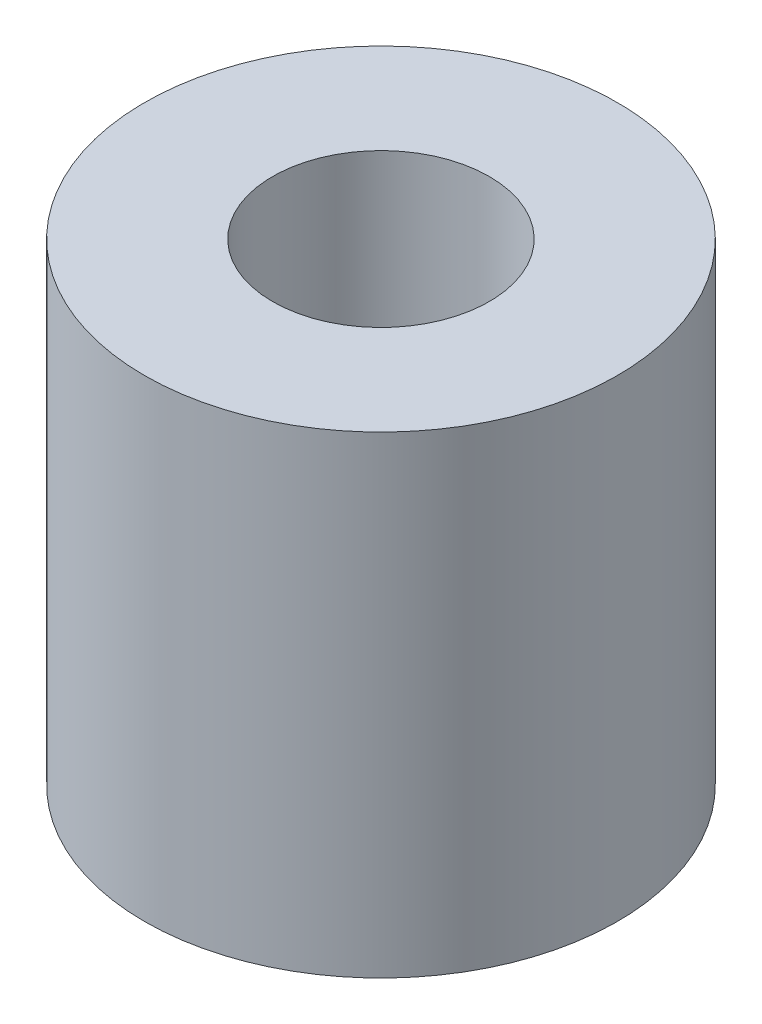
ISO-10303-21;
HEADER;
FILE_DESCRIPTION(('STEP AP214'),'2;1');
FILE_NAME('part.step','',(''),(''),'','','');
FILE_SCHEMA(('AUTOMOTIVE_DESIGN { 1 0 10303 214 1 1 1 1 }'));
ENDSEC;
DATA;
#1=APPLICATION_CONTEXT('core data for automotive mechanical design processes');
#2=APPLICATION_PROTOCOL_DEFINITION('international standard','automotive_design',2000,#1);
#3=PRODUCT_CONTEXT('',#1,'mechanical');
#4=PRODUCT('Part','Part','',(#3));
#5=PRODUCT_RELATED_PRODUCT_CATEGORY('part','',(#4));
#6=PRODUCT_DEFINITION_FORMATION('','',#4);
#7=PRODUCT_DEFINITION_CONTEXT('part definition',#1,'design');
#8=PRODUCT_DEFINITION('design','',#6,#7);
#9=PRODUCT_DEFINITION_SHAPE('','',#8);
#10=(LENGTH_UNIT() NAMED_UNIT(*) SI_UNIT(.MILLI.,.METRE.));
#11=(NAMED_UNIT(*) PLANE_ANGLE_UNIT() SI_UNIT($,.RADIAN.));
#12=(NAMED_UNIT(*) SI_UNIT($,.STERADIAN.) SOLID_ANGLE_UNIT());
#13=UNCERTAINTY_MEASURE_WITH_UNIT(LENGTH_MEASURE(1.E-05),#10,'distance_accuracy_value','');
#14=(GEOMETRIC_REPRESENTATION_CONTEXT(3) GLOBAL_UNCERTAINTY_ASSIGNED_CONTEXT((#13)) GLOBAL_UNIT_ASSIGNED_CONTEXT((#10,
#11,#12)) REPRESENTATION_CONTEXT('',''));
#15=CARTESIAN_POINT('',(0.,0.,0.));
#16=DIRECTION('',(0.,0.,1.));
#17=DIRECTION('',(1.,0.,0.));
#18=AXIS2_PLACEMENT_3D('',#15,#16,#17);
#19=CARTESIAN_POINT('',(0.,6.,0.));
#20=DIRECTION('',(0.,1.,0.));
#21=DIRECTION('',(0.,0.,1.));
#22=AXIS2_PLACEMENT_3D('',#19,#20,#21);
#23=PLANE('',#22);
#24=CARTESIAN_POINT('',(0.,6.,0.));
#25=DIRECTION('',(0.,1.,0.));
#26=DIRECTION('',(0.,0.,1.));
#27=AXIS2_PLACEMENT_3D('',#24,#25,#26);
#28=CIRCLE('',#27,3.);
#29=CARTESIAN_POINT('',(0.,6.,3.));
#30=VERTEX_POINT('',#29);
#31=EDGE_CURVE('E10',#30,#30,#28,.T.);
#32=ORIENTED_EDGE('',*,*,#31,.T.);
#33=EDGE_LOOP('',(#32));
#34=FACE_BOUND('',#33,.T.);
#35=CARTESIAN_POINT('',(0.,6.,0.));
#36=DIRECTION('',(0.,1.,0.));
#37=DIRECTION('',(0.,0.,1.));
#38=AXIS2_PLACEMENT_3D('',#35,#36,#37);
#39=CIRCLE('',#38,1.375);
#40=CARTESIAN_POINT('',(0.,6.,1.375));
#41=VERTEX_POINT('',#40);
#42=EDGE_CURVE('E41',#41,#41,#39,.T.);
#43=ORIENTED_EDGE('',*,*,#42,.F.);
#44=EDGE_LOOP('',(#43));
#45=FACE_BOUND('',#44,.T.);
#46=ADVANCED_FACE('F30',(#34,#45),#23,.T.);
#47=CARTESIAN_POINT('',(0.,0.,0.));
#48=DIRECTION('',(0.,1.,0.));
#49=DIRECTION('',(0.,0.,1.));
#50=AXIS2_PLACEMENT_3D('',#47,#48,#49);
#51=PLANE('',#50);
#52=CARTESIAN_POINT('',(0.,0.,0.));
#53=DIRECTION('',(0.,1.,0.));
#54=DIRECTION('',(0.,0.,1.));
#55=AXIS2_PLACEMENT_3D('',#52,#53,#54);
#56=CIRCLE('',#55,3.);
#57=CARTESIAN_POINT('',(0.,0.,3.));
#58=VERTEX_POINT('',#57);
#59=EDGE_CURVE('E34',#58,#58,#56,.T.);
#60=ORIENTED_EDGE('',*,*,#59,.F.);
#61=EDGE_LOOP('',(#60));
#62=FACE_BOUND('',#61,.T.);
#63=CARTESIAN_POINT('',(0.,0.,0.));
#64=DIRECTION('',(0.,1.,0.));
#65=DIRECTION('',(0.,0.,1.));
#66=AXIS2_PLACEMENT_3D('',#63,#64,#65);
#67=CIRCLE('',#66,1.375);
#68=CARTESIAN_POINT('',(0.,0.,1.375));
#69=VERTEX_POINT('',#68);
#70=EDGE_CURVE('E43',#69,#69,#67,.T.);
#71=ORIENTED_EDGE('',*,*,#70,.T.);
#72=EDGE_LOOP('',(#71));
#73=FACE_BOUND('',#72,.T.);
#74=ADVANCED_FACE('F53',(#62,#73),#51,.F.);
#75=CARTESIAN_POINT('',(0.,6.,0.));
#76=DIRECTION('',(0.,-1.,0.));
#77=DIRECTION('',(0.,0.,-1.));
#78=AXIS2_PLACEMENT_3D('',#75,#76,#77);
#79=CYLINDRICAL_SURFACE('',#78,3.);
#80=ORIENTED_EDGE('',*,*,#31,.F.);
#81=EDGE_LOOP('',(#80));
#82=FACE_BOUND('',#81,.T.);
#83=ORIENTED_EDGE('',*,*,#59,.T.);
#84=EDGE_LOOP('',(#83));
#85=FACE_BOUND('',#84,.T.);
#86=ADVANCED_FACE('F32',(#82,#85),#79,.T.);
#87=CARTESIAN_POINT('',(0.,6.,0.));
#88=DIRECTION('',(0.,-1.,0.));
#89=DIRECTION('',(0.,0.,-1.));
#90=AXIS2_PLACEMENT_3D('',#87,#88,#89);
#91=CYLINDRICAL_SURFACE('',#90,1.375);
#92=ORIENTED_EDGE('',*,*,#42,.T.);
#93=EDGE_LOOP('',(#92));
#94=FACE_BOUND('',#93,.T.);
#95=ORIENTED_EDGE('',*,*,#70,.F.);
#96=EDGE_LOOP('',(#95));
#97=FACE_BOUND('',#96,.T.);
#98=ADVANCED_FACE('F49',(#94,#97),#91,.F.);
#99=CLOSED_SHELL('',(#46,#74,#86,#98));
#100=MANIFOLD_SOLID_BREP('B2',#99);
#101=ADVANCED_BREP_SHAPE_REPRESENTATION('',(#18,#100),#14);
#102=SHAPE_DEFINITION_REPRESENTATION(#9,#101);
ENDSEC;
END-ISO-10303-21;
